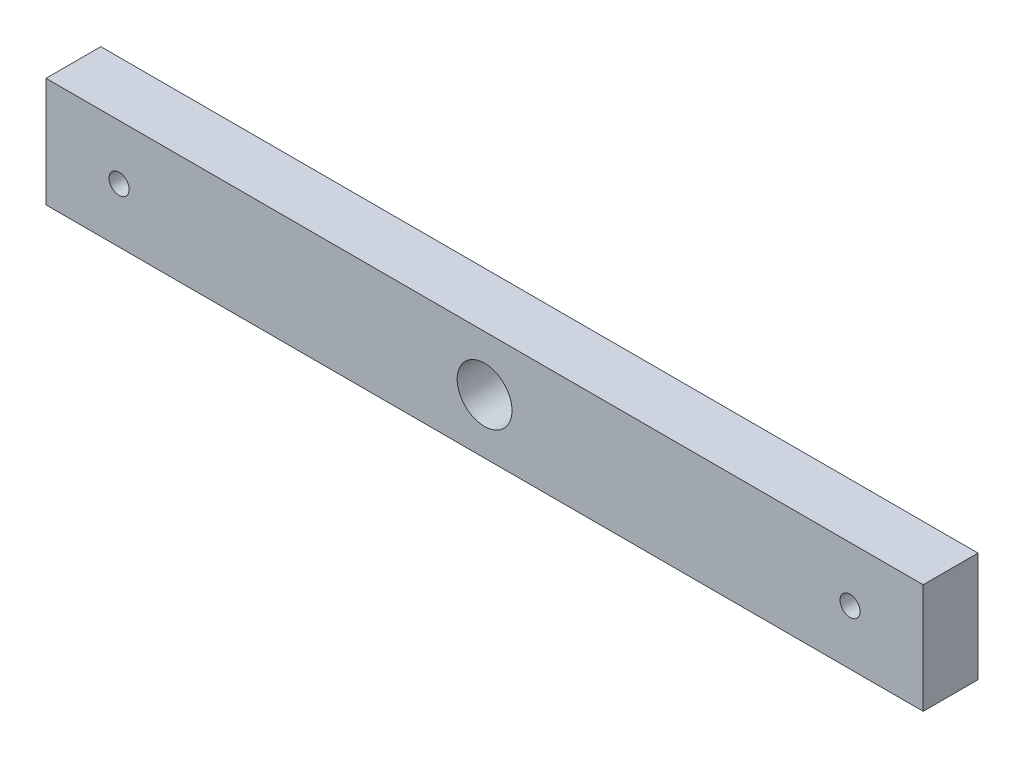
ISO-10303-21;
HEADER;
FILE_DESCRIPTION(('STEP AP214'),'2;1');
FILE_NAME('part.step','',(''),(''),'','','');
FILE_SCHEMA(('AUTOMOTIVE_DESIGN { 1 0 10303 214 1 1 1 1 }'));
ENDSEC;
DATA;
#1=APPLICATION_CONTEXT('core data for automotive mechanical design processes');
#2=APPLICATION_PROTOCOL_DEFINITION('international standard','automotive_design',2000,#1);
#3=PRODUCT_CONTEXT('',#1,'mechanical');
#4=PRODUCT('Part','Part','',(#3));
#5=PRODUCT_RELATED_PRODUCT_CATEGORY('part','',(#4));
#6=PRODUCT_DEFINITION_FORMATION('','',#4);
#7=PRODUCT_DEFINITION_CONTEXT('part definition',#1,'design');
#8=PRODUCT_DEFINITION('design','',#6,#7);
#9=PRODUCT_DEFINITION_SHAPE('','',#8);
#10=(LENGTH_UNIT() NAMED_UNIT(*) SI_UNIT(.MILLI.,.METRE.));
#11=(NAMED_UNIT(*) PLANE_ANGLE_UNIT() SI_UNIT($,.RADIAN.));
#12=(NAMED_UNIT(*) SI_UNIT($,.STERADIAN.) SOLID_ANGLE_UNIT());
#13=UNCERTAINTY_MEASURE_WITH_UNIT(LENGTH_MEASURE(1.E-05),#10,'distance_accuracy_value','');
#14=(GEOMETRIC_REPRESENTATION_CONTEXT(3) GLOBAL_UNCERTAINTY_ASSIGNED_CONTEXT((#13)) GLOBAL_UNIT_ASSIGNED_CONTEXT((#10,
#11,#12)) REPRESENTATION_CONTEXT('',''));
#15=CARTESIAN_POINT('',(0.,0.,0.));
#16=DIRECTION('',(0.,0.,1.));
#17=DIRECTION('',(1.,0.,0.));
#18=AXIS2_PLACEMENT_3D('',#15,#16,#17);
#19=CARTESIAN_POINT('',(0.,0.,15.));
#20=DIRECTION('',(0.,0.,1.));
#21=DIRECTION('',(1.,0.,0.));
#22=AXIS2_PLACEMENT_3D('',#19,#20,#21);
#23=PLANE('',#22);
#24=CARTESIAN_POINT('',(100.,14.9999999999998,15.));
#25=DIRECTION('',(0.,0.,1.));
#26=DIRECTION('',(1.,0.,0.));
#27=AXIS2_PLACEMENT_3D('',#24,#25,#26);
#28=CIRCLE('',#27,2.75000000000001);
#29=CARTESIAN_POINT('',(102.75,14.9999999999998,15.));
#30=VERTEX_POINT('',#29);
#31=EDGE_CURVE('E125',#30,#30,#28,.F.);
#32=ORIENTED_EDGE('',*,*,#31,.T.);
#33=EDGE_LOOP('',(#32));
#34=FACE_BOUND('',#33,.T.);
#35=CARTESIAN_POINT('',(0.,15.,15.));
#36=DIRECTION('',(0.,0.,1.));
#37=DIRECTION('',(1.,0.,0.));
#38=AXIS2_PLACEMENT_3D('',#35,#36,#37);
#39=CIRCLE('',#38,7.5);
#40=CARTESIAN_POINT('',(7.50000000000001,15.,15.));
#41=VERTEX_POINT('',#40);
#42=EDGE_CURVE('E123',#41,#41,#39,.T.);
#43=ORIENTED_EDGE('',*,*,#42,.F.);
#44=EDGE_LOOP('',(#43));
#45=FACE_BOUND('',#44,.T.);
#46=DIRECTION('',(0.,-1.,0.));
#47=VECTOR('',#46,1.);
#48=CARTESIAN_POINT('',(-120.,30.,15.));
#49=LINE('',#48,#47);
#50=CARTESIAN_POINT('',(-120.,30.,15.));
#51=VERTEX_POINT('',#50);
#52=CARTESIAN_POINT('',(-120.,0.,15.));
#53=VERTEX_POINT('',#52);
#54=EDGE_CURVE('E93',#51,#53,#49,.T.);
#55=ORIENTED_EDGE('',*,*,#54,.T.);
#56=DIRECTION('',(1.,0.,0.));
#57=VECTOR('',#56,1.);
#58=CARTESIAN_POINT('',(-120.,0.,15.));
#59=LINE('',#58,#57);
#60=CARTESIAN_POINT('',(120.,0.,15.));
#61=VERTEX_POINT('',#60);
#62=EDGE_CURVE('E87',#53,#61,#59,.T.);
#63=ORIENTED_EDGE('',*,*,#62,.T.);
#64=DIRECTION('',(0.,1.,0.));
#65=VECTOR('',#64,1.);
#66=CARTESIAN_POINT('',(120.,30.,15.));
#67=LINE('',#66,#65);
#68=CARTESIAN_POINT('',(120.,30.,15.));
#69=VERTEX_POINT('',#68);
#70=EDGE_CURVE('E90',#61,#69,#67,.T.);
#71=ORIENTED_EDGE('',*,*,#70,.T.);
#72=DIRECTION('',(-1.,0.,0.));
#73=VECTOR('',#72,1.);
#74=CARTESIAN_POINT('',(100.,30.,15.));
#75=LINE('',#74,#73);
#76=EDGE_CURVE('E59',#69,#51,#75,.T.);
#77=ORIENTED_EDGE('',*,*,#76,.T.);
#78=EDGE_LOOP('',(#55,#63,#71,#77));
#79=FACE_BOUND('',#78,.T.);
#80=CARTESIAN_POINT('',(-100.,15.,15.));
#81=DIRECTION('',(0.,0.,1.));
#82=DIRECTION('',(1.,0.,0.));
#83=AXIS2_PLACEMENT_3D('',#80,#81,#82);
#84=CIRCLE('',#83,2.75000000000001);
#85=CARTESIAN_POINT('',(-97.25,15.,15.));
#86=VERTEX_POINT('',#85);
#87=EDGE_CURVE('E119',#86,#86,#84,.T.);
#88=ORIENTED_EDGE('',*,*,#87,.F.);
#89=EDGE_LOOP('',(#88));
#90=FACE_BOUND('',#89,.T.);
#91=ADVANCED_FACE('F40',(#34,#45,#79,#90),#23,.T.);
#92=CARTESIAN_POINT('',(0.,0.,0.));
#93=DIRECTION('',(0.,0.,1.));
#94=DIRECTION('',(1.,0.,0.));
#95=AXIS2_PLACEMENT_3D('',#92,#93,#94);
#96=PLANE('',#95);
#97=DIRECTION('',(0.,-1.,0.));
#98=VECTOR('',#97,1.);
#99=CARTESIAN_POINT('',(-120.,30.,0.));
#100=LINE('',#99,#98);
#101=CARTESIAN_POINT('',(-120.,30.,0.));
#102=VERTEX_POINT('',#101);
#103=CARTESIAN_POINT('',(-120.,0.,0.));
#104=VERTEX_POINT('',#103);
#105=EDGE_CURVE('E108',#102,#104,#100,.T.);
#106=ORIENTED_EDGE('',*,*,#105,.F.);
#107=DIRECTION('',(-1.,0.,0.));
#108=VECTOR('',#107,1.);
#109=CARTESIAN_POINT('',(-100.,30.,0.));
#110=LINE('',#109,#108);
#111=CARTESIAN_POINT('',(120.,30.,0.));
#112=VERTEX_POINT('',#111);
#113=EDGE_CURVE('E76',#112,#102,#110,.T.);
#114=ORIENTED_EDGE('',*,*,#113,.F.);
#115=DIRECTION('',(0.,1.,0.));
#116=VECTOR('',#115,1.);
#117=CARTESIAN_POINT('',(120.,30.,0.));
#118=LINE('',#117,#116);
#119=CARTESIAN_POINT('',(120.,0.,0.));
#120=VERTEX_POINT('',#119);
#121=EDGE_CURVE('E113',#120,#112,#118,.T.);
#122=ORIENTED_EDGE('',*,*,#121,.F.);
#123=DIRECTION('',(1.,0.,0.));
#124=VECTOR('',#123,1.);
#125=CARTESIAN_POINT('',(100.,0.,0.));
#126=LINE('',#125,#124);
#127=EDGE_CURVE('E98',#104,#120,#126,.T.);
#128=ORIENTED_EDGE('',*,*,#127,.F.);
#129=EDGE_LOOP('',(#106,#114,#122,#128));
#130=FACE_BOUND('',#129,.T.);
#131=CARTESIAN_POINT('',(0.,15.,0.));
#132=DIRECTION('',(0.,0.,1.));
#133=DIRECTION('',(1.,0.,0.));
#134=AXIS2_PLACEMENT_3D('',#131,#132,#133);
#135=CIRCLE('',#134,7.5);
#136=CARTESIAN_POINT('',(7.50000000000001,15.,0.));
#137=VERTEX_POINT('',#136);
#138=EDGE_CURVE('E111',#137,#137,#135,.T.);
#139=ORIENTED_EDGE('',*,*,#138,.T.);
#140=EDGE_LOOP('',(#139));
#141=FACE_BOUND('',#140,.T.);
#142=CARTESIAN_POINT('',(100.,14.9999999999998,0.));
#143=DIRECTION('',(0.,0.,1.));
#144=DIRECTION('',(1.,0.,0.));
#145=AXIS2_PLACEMENT_3D('',#142,#143,#144);
#146=CIRCLE('',#145,2.75000000000001);
#147=CARTESIAN_POINT('',(102.75,14.9999999999998,0.));
#148=VERTEX_POINT('',#147);
#149=EDGE_CURVE('E117',#148,#148,#146,.F.);
#150=ORIENTED_EDGE('',*,*,#149,.F.);
#151=EDGE_LOOP('',(#150));
#152=FACE_BOUND('',#151,.T.);
#153=CARTESIAN_POINT('',(-100.,15.,0.));
#154=DIRECTION('',(0.,0.,1.));
#155=DIRECTION('',(1.,0.,0.));
#156=AXIS2_PLACEMENT_3D('',#153,#154,#155);
#157=CIRCLE('',#156,2.75000000000001);
#158=CARTESIAN_POINT('',(-97.25,15.,0.));
#159=VERTEX_POINT('',#158);
#160=EDGE_CURVE('E44',#159,#159,#157,.T.);
#161=ORIENTED_EDGE('',*,*,#160,.T.);
#162=EDGE_LOOP('',(#161));
#163=FACE_BOUND('',#162,.T.);
#164=ADVANCED_FACE('F140',(#130,#141,#152,#163),#96,.F.);
#165=CARTESIAN_POINT('',(-120.,30.,15.));
#166=DIRECTION('',(1.,0.,0.));
#167=DIRECTION('',(0.,0.,-1.));
#168=AXIS2_PLACEMENT_3D('',#165,#166,#167);
#169=PLANE('',#168);
#170=ORIENTED_EDGE('',*,*,#105,.T.);
#171=DIRECTION('',(0.,0.,-1.));
#172=VECTOR('',#171,1.);
#173=CARTESIAN_POINT('',(-120.,0.,15.));
#174=LINE('',#173,#172);
#175=EDGE_CURVE('E11',#53,#104,#174,.T.);
#176=ORIENTED_EDGE('',*,*,#175,.F.);
#177=ORIENTED_EDGE('',*,*,#54,.F.);
#178=DIRECTION('',(0.,0.,-1.));
#179=VECTOR('',#178,1.);
#180=CARTESIAN_POINT('',(-120.,30.,15.));
#181=LINE('',#180,#179);
#182=EDGE_CURVE('E104',#51,#102,#181,.T.);
#183=ORIENTED_EDGE('',*,*,#182,.T.);
#184=EDGE_LOOP('',(#170,#176,#177,#183));
#185=FACE_BOUND('',#184,.T.);
#186=ADVANCED_FACE('F42',(#185),#169,.F.);
#187=CARTESIAN_POINT('',(100.,0.,15.));
#188=DIRECTION('',(0.,1.,0.));
#189=DIRECTION('',(0.,0.,1.));
#190=AXIS2_PLACEMENT_3D('',#187,#188,#189);
#191=PLANE('',#190);
#192=ORIENTED_EDGE('',*,*,#127,.T.);
#193=DIRECTION('',(0.,0.,-1.));
#194=VECTOR('',#193,1.);
#195=CARTESIAN_POINT('',(120.,0.,15.));
#196=LINE('',#195,#194);
#197=EDGE_CURVE('E50',#61,#120,#196,.T.);
#198=ORIENTED_EDGE('',*,*,#197,.F.);
#199=ORIENTED_EDGE('',*,*,#62,.F.);
#200=ORIENTED_EDGE('',*,*,#175,.T.);
#201=EDGE_LOOP('',(#192,#198,#199,#200));
#202=FACE_BOUND('',#201,.T.);
#203=ADVANCED_FACE('F97',(#202),#191,.F.);
#204=CARTESIAN_POINT('',(120.,30.,15.));
#205=DIRECTION('',(-1.,0.,0.));
#206=DIRECTION('',(0.,0.,1.));
#207=AXIS2_PLACEMENT_3D('',#204,#205,#206);
#208=PLANE('',#207);
#209=ORIENTED_EDGE('',*,*,#121,.T.);
#210=DIRECTION('',(0.,0.,-1.));
#211=VECTOR('',#210,1.);
#212=CARTESIAN_POINT('',(120.,30.,15.));
#213=LINE('',#212,#211);
#214=EDGE_CURVE('E100',#69,#112,#213,.T.);
#215=ORIENTED_EDGE('',*,*,#214,.F.);
#216=ORIENTED_EDGE('',*,*,#70,.F.);
#217=ORIENTED_EDGE('',*,*,#197,.T.);
#218=EDGE_LOOP('',(#209,#215,#216,#217));
#219=FACE_BOUND('',#218,.T.);
#220=ADVANCED_FACE('F102',(#219),#208,.F.);
#221=CARTESIAN_POINT('',(-100.,30.,15.));
#222=DIRECTION('',(0.,-1.,0.));
#223=DIRECTION('',(0.,0.,-1.));
#224=AXIS2_PLACEMENT_3D('',#221,#222,#223);
#225=PLANE('',#224);
#226=ORIENTED_EDGE('',*,*,#113,.T.);
#227=ORIENTED_EDGE('',*,*,#182,.F.);
#228=ORIENTED_EDGE('',*,*,#76,.F.);
#229=ORIENTED_EDGE('',*,*,#214,.T.);
#230=EDGE_LOOP('',(#226,#227,#228,#229));
#231=FACE_BOUND('',#230,.T.);
#232=ADVANCED_FACE('F151',(#231),#225,.F.);
#233=CARTESIAN_POINT('',(0.,15.,0.));
#234=DIRECTION('',(0.,0.,1.));
#235=DIRECTION('',(1.,0.,0.));
#236=AXIS2_PLACEMENT_3D('',#233,#234,#235);
#237=CYLINDRICAL_SURFACE('',#236,7.5);
#238=ORIENTED_EDGE('',*,*,#138,.F.);
#239=EDGE_LOOP('',(#238));
#240=FACE_BOUND('',#239,.T.);
#241=ORIENTED_EDGE('',*,*,#42,.T.);
#242=EDGE_LOOP('',(#241));
#243=FACE_BOUND('',#242,.T.);
#244=ADVANCED_FACE('F137',(#240,#243),#237,.F.);
#245=CARTESIAN_POINT('',(100.,14.9999999999998,-35.));
#246=DIRECTION('',(0.,0.,1.));
#247=DIRECTION('',(1.,0.,0.));
#248=AXIS2_PLACEMENT_3D('',#245,#246,#247);
#249=CYLINDRICAL_SURFACE('',#248,2.75000000000001);
#250=ORIENTED_EDGE('',*,*,#31,.F.);
#251=EDGE_LOOP('',(#250));
#252=FACE_BOUND('',#251,.T.);
#253=ORIENTED_EDGE('',*,*,#149,.T.);
#254=EDGE_LOOP('',(#253));
#255=FACE_BOUND('',#254,.T.);
#256=ADVANCED_FACE('F170',(#252,#255),#249,.F.);
#257=CARTESIAN_POINT('',(-100.,15.,-35.));
#258=DIRECTION('',(0.,0.,1.));
#259=DIRECTION('',(1.,0.,0.));
#260=AXIS2_PLACEMENT_3D('',#257,#258,#259);
#261=CYLINDRICAL_SURFACE('',#260,2.75000000000001);
#262=ORIENTED_EDGE('',*,*,#87,.T.);
#263=EDGE_LOOP('',(#262));
#264=FACE_BOUND('',#263,.T.);
#265=ORIENTED_EDGE('',*,*,#160,.F.);
#266=EDGE_LOOP('',(#265));
#267=FACE_BOUND('',#266,.T.);
#268=ADVANCED_FACE('F168',(#264,#267),#261,.F.);
#269=CLOSED_SHELL('',(#91,#164,#186,#203,#220,#232,#244,#256,#268));
#270=MANIFOLD_SOLID_BREP('B2',#269);
#271=ADVANCED_BREP_SHAPE_REPRESENTATION('',(#18,#270),#14);
#272=SHAPE_DEFINITION_REPRESENTATION(#9,#271);
ENDSEC;
END-ISO-10303-21;
